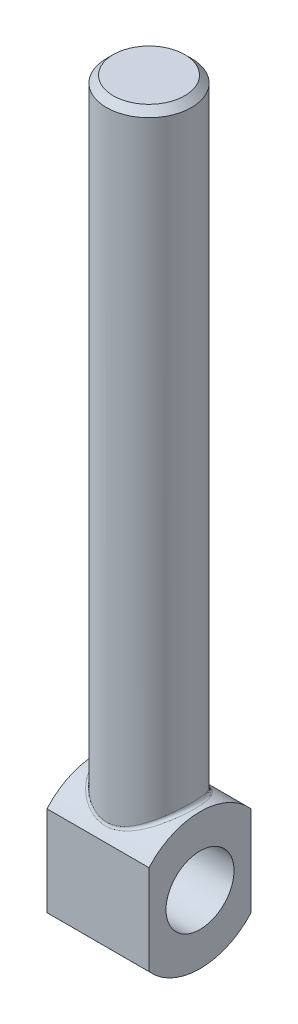
ISO-10303-21;
HEADER;
FILE_DESCRIPTION(('STEP AP214'),'2;1');
FILE_NAME('part.step','',(''),(''),'','','');
FILE_SCHEMA(('AUTOMOTIVE_DESIGN { 1 0 10303 214 1 1 1 1 }'));
ENDSEC;
DATA;
#1=APPLICATION_CONTEXT('core data for automotive mechanical design processes');
#2=APPLICATION_PROTOCOL_DEFINITION('international standard','automotive_design',2000,#1);
#3=PRODUCT_CONTEXT('',#1,'mechanical');
#4=PRODUCT('Part','Part','',(#3));
#5=PRODUCT_RELATED_PRODUCT_CATEGORY('part','',(#4));
#6=PRODUCT_DEFINITION_FORMATION('','',#4);
#7=PRODUCT_DEFINITION_CONTEXT('part definition',#1,'design');
#8=PRODUCT_DEFINITION('design','',#6,#7);
#9=PRODUCT_DEFINITION_SHAPE('','',#8);
#10=(LENGTH_UNIT() NAMED_UNIT(*) SI_UNIT(.MILLI.,.METRE.));
#11=(NAMED_UNIT(*) PLANE_ANGLE_UNIT() SI_UNIT($,.RADIAN.));
#12=(NAMED_UNIT(*) SI_UNIT($,.STERADIAN.) SOLID_ANGLE_UNIT());
#13=UNCERTAINTY_MEASURE_WITH_UNIT(LENGTH_MEASURE(1.E-05),#10,'distance_accuracy_value','');
#14=(GEOMETRIC_REPRESENTATION_CONTEXT(3) GLOBAL_UNCERTAINTY_ASSIGNED_CONTEXT((#13)) GLOBAL_UNIT_ASSIGNED_CONTEXT((#10,
#11,#12)) REPRESENTATION_CONTEXT('',''));
#15=CARTESIAN_POINT('',(0.,0.,0.));
#16=DIRECTION('',(0.,0.,1.));
#17=DIRECTION('',(1.,0.,0.));
#18=AXIS2_PLACEMENT_3D('',#15,#16,#17);
#19=CARTESIAN_POINT('',(3.,0.,0.));
#20=DIRECTION('',(-1.,0.,0.));
#21=DIRECTION('',(0.,0.,1.));
#22=AXIS2_PLACEMENT_3D('',#19,#20,#21);
#23=CYLINDRICAL_SURFACE('',#22,4.);
#24=CARTESIAN_POINT('',(3.,0.,0.));
#25=DIRECTION('',(1.,0.,0.));
#26=DIRECTION('',(0.,0.,-1.));
#27=AXIS2_PLACEMENT_3D('',#24,#25,#26);
#28=CIRCLE('',#27,4.);
#29=CARTESIAN_POINT('',(3.,2.64575131106459,-3.));
#30=VERTEX_POINT('',#29);
#31=CARTESIAN_POINT('',(3.,2.64575131106459,3.));
#32=VERTEX_POINT('',#31);
#33=EDGE_CURVE('E110',#30,#32,#28,.T.);
#34=ORIENTED_EDGE('',*,*,#33,.F.);
#35=DIRECTION('',(-1.,0.,0.));
#36=VECTOR('',#35,1.);
#37=CARTESIAN_POINT('',(3.,2.64575131106459,-3.));
#38=LINE('',#37,#36);
#39=CARTESIAN_POINT('',(-3.,2.64575131106459,-3.));
#40=VERTEX_POINT('',#39);
#41=EDGE_CURVE('E79',#30,#40,#38,.T.);
#42=ORIENTED_EDGE('',*,*,#41,.T.);
#43=CARTESIAN_POINT('',(-3.,0.,0.));
#44=DIRECTION('',(1.,0.,0.));
#45=DIRECTION('',(0.,0.,-1.));
#46=AXIS2_PLACEMENT_3D('',#43,#44,#45);
#47=CIRCLE('',#46,4.);
#48=CARTESIAN_POINT('',(-3.,2.64575131106459,3.));
#49=VERTEX_POINT('',#48);
#50=EDGE_CURVE('E102',#40,#49,#47,.T.);
#51=ORIENTED_EDGE('',*,*,#50,.T.);
#52=DIRECTION('',(-1.,0.,0.));
#53=VECTOR('',#52,1.);
#54=CARTESIAN_POINT('',(3.,2.64575131106459,3.));
#55=LINE('',#54,#53);
#56=EDGE_CURVE('E83',#32,#49,#55,.T.);
#57=ORIENTED_EDGE('',*,*,#56,.F.);
#58=EDGE_LOOP('',(#34,#42,#51,#57));
#59=FACE_BOUND('',#58,.T.);
#60=ADVANCED_FACE('F46',(#59),#23,.T.);
#61=CARTESIAN_POINT('',(-3.,-2.64575131106459,3.));
#62=VERTEX_POINT('',#61);
#63=CARTESIAN_POINT('',(-3.,-2.64575131106459,-3.));
#64=VERTEX_POINT('',#63);
#65=EDGE_CURVE('E100',#62,#64,#47,.T.);
#66=ORIENTED_EDGE('',*,*,#65,.T.);
#67=DIRECTION('',(-1.,0.,0.));
#68=VECTOR('',#67,1.);
#69=CARTESIAN_POINT('',(3.,-2.64575131106459,-3.));
#70=LINE('',#69,#68);
#71=CARTESIAN_POINT('',(3.,-2.64575131106459,-3.));
#72=VERTEX_POINT('',#71);
#73=EDGE_CURVE('E86',#72,#64,#70,.T.);
#74=ORIENTED_EDGE('',*,*,#73,.F.);
#75=CARTESIAN_POINT('',(3.,-2.64575131106459,3.));
#76=VERTEX_POINT('',#75);
#77=EDGE_CURVE('E108',#76,#72,#28,.T.);
#78=ORIENTED_EDGE('',*,*,#77,.F.);
#79=DIRECTION('',(-1.,0.,0.));
#80=VECTOR('',#79,1.);
#81=CARTESIAN_POINT('',(3.,-2.64575131106459,3.));
#82=LINE('',#81,#80);
#83=EDGE_CURVE('E105',#76,#62,#82,.T.);
#84=ORIENTED_EDGE('',*,*,#83,.T.);
#85=EDGE_LOOP('',(#66,#74,#78,#84));
#86=FACE_BOUND('',#85,.T.);
#87=ADVANCED_FACE('F104',(#86),#23,.T.);
#88=CARTESIAN_POINT('',(3.,0.,0.));
#89=DIRECTION('',(1.,0.,0.));
#90=DIRECTION('',(0.,0.,-1.));
#91=AXIS2_PLACEMENT_3D('',#88,#89,#90);
#92=PLANE('',#91);
#93=CARTESIAN_POINT('',(3.,0.,0.));
#94=DIRECTION('',(-1.,0.,0.));
#95=DIRECTION('',(0.,0.,1.));
#96=AXIS2_PLACEMENT_3D('',#93,#94,#95);
#97=CIRCLE('',#96,2.);
#98=CARTESIAN_POINT('',(3.,0.,2.));
#99=VERTEX_POINT('',#98);
#100=EDGE_CURVE('E49',#99,#99,#97,.T.);
#101=ORIENTED_EDGE('',*,*,#100,.T.);
#102=EDGE_LOOP('',(#101));
#103=FACE_BOUND('',#102,.T.);
#104=DIRECTION('',(0.,1.,0.));
#105=VECTOR('',#104,1.);
#106=CARTESIAN_POINT('',(3.,0.,-3.));
#107=LINE('',#106,#105);
#108=EDGE_CURVE('E90',#72,#30,#107,.T.);
#109=ORIENTED_EDGE('',*,*,#108,.T.);
#110=ORIENTED_EDGE('',*,*,#33,.T.);
#111=DIRECTION('',(0.,1.,0.));
#112=VECTOR('',#111,1.);
#113=CARTESIAN_POINT('',(3.,0.,3.));
#114=LINE('',#113,#112);
#115=EDGE_CURVE('E114',#76,#32,#114,.T.);
#116=ORIENTED_EDGE('',*,*,#115,.F.);
#117=ORIENTED_EDGE('',*,*,#77,.T.);
#118=EDGE_LOOP('',(#109,#110,#116,#117));
#119=FACE_BOUND('',#118,.T.);
#120=ADVANCED_FACE('F120',(#103,#119),#92,.T.);
#121=CARTESIAN_POINT('',(-3.,0.,0.));
#122=DIRECTION('',(1.,0.,0.));
#123=DIRECTION('',(0.,0.,-1.));
#124=AXIS2_PLACEMENT_3D('',#121,#122,#123);
#125=PLANE('',#124);
#126=CARTESIAN_POINT('',(-3.,0.,0.));
#127=DIRECTION('',(-1.,0.,0.));
#128=DIRECTION('',(0.,0.,1.));
#129=AXIS2_PLACEMENT_3D('',#126,#127,#128);
#130=CIRCLE('',#129,2.);
#131=CARTESIAN_POINT('',(-3.,0.,2.));
#132=VERTEX_POINT('',#131);
#133=EDGE_CURVE('E12',#132,#132,#130,.T.);
#134=ORIENTED_EDGE('',*,*,#133,.F.);
#135=EDGE_LOOP('',(#134));
#136=FACE_BOUND('',#135,.T.);
#137=ORIENTED_EDGE('',*,*,#50,.F.);
#138=DIRECTION('',(0.,1.,0.));
#139=VECTOR('',#138,1.);
#140=CARTESIAN_POINT('',(-3.,0.,-3.));
#141=LINE('',#140,#139);
#142=EDGE_CURVE('E89',#64,#40,#141,.T.);
#143=ORIENTED_EDGE('',*,*,#142,.F.);
#144=ORIENTED_EDGE('',*,*,#65,.F.);
#145=DIRECTION('',(0.,1.,0.));
#146=VECTOR('',#145,1.);
#147=CARTESIAN_POINT('',(-3.,0.,3.));
#148=LINE('',#147,#146);
#149=EDGE_CURVE('E62',#62,#49,#148,.T.);
#150=ORIENTED_EDGE('',*,*,#149,.T.);
#151=EDGE_LOOP('',(#137,#143,#144,#150));
#152=FACE_BOUND('',#151,.T.);
#153=ADVANCED_FACE('F99',(#136,#152),#125,.F.);
#154=CARTESIAN_POINT('',(3.,0.,3.));
#155=DIRECTION('',(0.,0.,1.));
#156=DIRECTION('',(1.,0.,0.));
#157=AXIS2_PLACEMENT_3D('',#154,#155,#156);
#158=PLANE('',#157);
#159=ORIENTED_EDGE('',*,*,#149,.F.);
#160=ORIENTED_EDGE('',*,*,#83,.F.);
#161=ORIENTED_EDGE('',*,*,#115,.T.);
#162=ORIENTED_EDGE('',*,*,#56,.T.);
#163=EDGE_LOOP('',(#159,#160,#161,#162));
#164=FACE_BOUND('',#163,.T.);
#165=ADVANCED_FACE('F133',(#164),#158,.T.);
#166=CARTESIAN_POINT('',(3.,0.,-3.));
#167=DIRECTION('',(0.,0.,1.));
#168=DIRECTION('',(1.,0.,0.));
#169=AXIS2_PLACEMENT_3D('',#166,#167,#168);
#170=PLANE('',#169);
#171=ORIENTED_EDGE('',*,*,#142,.T.);
#172=ORIENTED_EDGE('',*,*,#41,.F.);
#173=ORIENTED_EDGE('',*,*,#108,.F.);
#174=ORIENTED_EDGE('',*,*,#73,.T.);
#175=EDGE_LOOP('',(#171,#172,#173,#174));
#176=FACE_BOUND('',#175,.T.);
#177=ADVANCED_FACE('F88',(#176),#170,.F.);
#178=CARTESIAN_POINT('',(3.,0.,0.));
#179=DIRECTION('',(-1.,0.,0.));
#180=DIRECTION('',(0.,0.,1.));
#181=AXIS2_PLACEMENT_3D('',#178,#179,#180);
#182=CYLINDRICAL_SURFACE('',#181,2.);
#183=ORIENTED_EDGE('',*,*,#100,.F.);
#184=EDGE_LOOP('',(#183));
#185=FACE_BOUND('',#184,.T.);
#186=ORIENTED_EDGE('',*,*,#133,.T.);
#187=EDGE_LOOP('',(#186));
#188=FACE_BOUND('',#187,.T.);
#189=ADVANCED_FACE('F124',(#185,#188),#182,.F.);
#190=CLOSED_SHELL('',(#60,#87,#120,#153,#165,#177,#189));
#191=MANIFOLD_SOLID_BREP('B2',#190);
#192=CARTESIAN_POINT('',(3.,0.,0.));
#193=DIRECTION('',(-1.,0.,0.));
#194=DIRECTION('',(0.,0.,1.));
#195=AXIS2_PLACEMENT_3D('',#192,#193,#194);
#196=CYLINDRICAL_SURFACE('',#195,4.);
#197=CARTESIAN_POINT('',(0.00954822163204484,3.21715811532178,-2.49998176622624));
#198=CARTESIAN_POINT('',(0.00984711982917236,3.12390662318316,-2.49998062463942));
#199=CARTESIAN_POINT('',(0.0103120793626084,3.06396010983027,-2.57140981668985));
#200=CARTESIAN_POINT('',(-0.102346887351053,3.21677036700459,-2.50040969262202));
#201=CARTESIAN_POINT('',(-0.105537420109464,3.12354283273414,-2.50043539427607));
#202=CARTESIAN_POINT('',(-0.110534638340057,3.0635908257028,-2.57184996954455));
#203=CARTESIAN_POINT('',(-0.21429020075692,3.22328653193699,-2.49327885304179));
#204=CARTESIAN_POINT('',(-0.221259244170947,3.12969276039507,-2.49281907066194));
#205=CARTESIAN_POINT('',(-0.231433416820897,3.06979669702363,-2.56451539166456));
#206=CARTESIAN_POINT('',(-0.435009736366286,3.24909656567273,-2.46438285730942));
#207=CARTESIAN_POINT('',(-0.44866986006418,3.15389345693847,-2.46213883644658));
#208=CARTESIAN_POINT('',(-0.469810515272162,3.09437768165235,-2.53479379612528));
#209=CARTESIAN_POINT('',(-0.543782843969047,3.26840258567563,-2.44260378407605));
#210=CARTESIAN_POINT('',(-0.560854563338687,3.17206483290037,-2.43892004452898));
#211=CARTESIAN_POINT('',(-0.587285471473778,3.11276436753144,-2.51239246375399));
#212=CARTESIAN_POINT('',(-0.755450166276625,3.31710352845769,-2.3856457498194));
#213=CARTESIAN_POINT('',(-0.778294499469588,3.21757806013281,-2.37858039630654));
#214=CARTESIAN_POINT('',(-0.815886179591528,3.15914621735777,-2.45380705682438));
#215=CARTESIAN_POINT('',(-0.858352972196771,3.34648324225128,-2.35048698035186));
#216=CARTESIAN_POINT('',(-0.883937662251834,3.2450797037186,-2.34123478674779));
#217=CARTESIAN_POINT('',(-0.927021210020152,3.18712689655799,-2.41764375072408));
#218=CARTESIAN_POINT('',(-1.05711271269485,3.41218022549462,-2.26806162497307));
#219=CARTESIAN_POINT('',(-1.08709172676679,3.30613063601418,-2.25425246119234));
#220=CARTESIAN_POINT('',(-1.14168172975108,3.24969545211758,-2.33286338523401));
#221=CARTESIAN_POINT('',(-1.15296717389699,3.44849991435416,-2.22079081460447));
#222=CARTESIAN_POINT('',(-1.18483265152331,3.33986091893003,-2.20430946221334));
#223=CARTESIAN_POINT('',(-1.24520454780751,3.28428563267719,-2.28424198068837));
#224=CARTESIAN_POINT('',(-1.35634125071307,3.53319084142273,-2.10400680971304));
#225=CARTESIAN_POINT('',(-1.39150277184332,3.41803158747329,-2.08157570753947));
#226=CARTESIAN_POINT('',(-1.46484855077161,3.36494365854757,-2.16412129004828));
#227=CARTESIAN_POINT('',(-1.4620453639553,3.58248690528422,-2.03190427936437));
#228=CARTESIAN_POINT('',(-1.49817235349947,3.46330272805284,-2.00591125316473));
#229=CARTESIAN_POINT('',(-1.57900899313801,3.41189228988917,-2.08995868693743));
#230=CARTESIAN_POINT('',(-1.66107729043178,3.68228723429981,-1.87272181346715));
#231=CARTESIAN_POINT('',(-1.69760563692384,3.55399909628589,-1.84053405133779));
#232=CARTESIAN_POINT('',(-1.79396347373621,3.50694022215852,-1.92622815049652));
#233=CARTESIAN_POINT('',(-1.75439106081195,3.73279279504906,-1.78562513634711));
#234=CARTESIAN_POINT('',(-1.79025677682375,3.59953311074717,-1.75028295469806));
#235=CARTESIAN_POINT('',(-1.89474234568546,3.55504075698829,-1.8366429972653));
#236=CARTESIAN_POINT('',(-1.94141375009508,3.838974333098,-1.58208271832439));
#237=CARTESIAN_POINT('',(-1.97484829448343,3.69438989345253,-1.54128586467245));
#238=CARTESIAN_POINT('',(-2.09672685009275,3.65616603175598,-1.62728508184499));
#239=CARTESIAN_POINT('',(-2.03271099413715,3.8941523981321,-1.4631672535127));
#240=CARTESIAN_POINT('',(-2.06327158652079,3.74279564380438,-1.42024220943881));
#241=CARTESIAN_POINT('',(-2.19532787371962,3.70871656933128,-1.50497203211585));
#242=CARTESIAN_POINT('',(-2.19375576520822,3.99479100437253,-1.20834520046678));
#243=CARTESIAN_POINT('',(-2.21791194346011,3.8300258686162,-1.16454212470812));
#244=CARTESIAN_POINT('',(-2.36925622641418,3.80456286094451,-1.2428693488957));
#245=CARTESIAN_POINT('',(-2.26351666710338,4.04025757135056,-1.07244923172584));
#246=CARTESIAN_POINT('',(-2.28321987609047,3.86842525180819,-1.02988947228783));
#247=CARTESIAN_POINT('',(-2.44459800033743,3.84786435381197,-1.10309063831186));
#248=CARTESIAN_POINT('',(-2.37375498919275,4.11342803459662,-0.797266295997932));
#249=CARTESIAN_POINT('',(-2.38588988233057,3.92975382798085,-0.760680630325499));
#250=CARTESIAN_POINT('',(-2.56365538845275,3.91755050900527,-0.820045333058661));
#251=CARTESIAN_POINT('',(-2.41597717440544,4.14217397544154,-0.658925574865658));
#252=CARTESIAN_POINT('',(-2.42412270615203,3.95314455369271,-0.627347863181621));
#253=CARTESIAN_POINT('',(-2.60925534882904,3.94492759482809,-0.677752019851812));
#254=CARTESIAN_POINT('',(-2.47593752149281,4.18326412026029,-0.375081589801691));
#255=CARTESIAN_POINT('',(-2.4786636512368,3.98669817029616,-0.355120944382691));
#256=CARTESIAN_POINT('',(-2.67401252367401,3.98406106605013,-0.385798206623646));
#257=CARTESIAN_POINT('',(-2.49371061477181,4.19563172368043,-0.229588852933674));
#258=CARTESIAN_POINT('',(-2.49437098908094,3.99649494144323,-0.217686697874435));
#259=CARTESIAN_POINT('',(-2.69320746406037,3.99583973663436,-0.23614853443916));
#260=CARTESIAN_POINT('',(-2.50274557788523,4.2019079022033,0.0400799682553251));
#261=CARTESIAN_POINT('',(-2.50245998592779,4.00153266855657,0.0381967083341126));
#262=CARTESIAN_POINT('',(-2.70296522402564,4.00181704989023,0.0412251101996328));
#263=CARTESIAN_POINT('',(-2.49765843638656,4.19835873149385,0.164099700936877));
#264=CARTESIAN_POINT('',(-2.49796952981467,3.99872566656385,0.15514436182214));
#265=CARTESIAN_POINT('',(-2.69747111129446,3.99843688715574,0.168788263820359));
#266=CARTESIAN_POINT('',(-2.46936786585877,4.17879251317735,0.40918008518493));
#267=CARTESIAN_POINT('',(-2.47247806218026,3.98291321537001,0.388448025828614));
#268=CARTESIAN_POINT('',(-2.66691729516989,3.9798023934274,0.420870944762257));
#269=CARTESIAN_POINT('',(-2.44616477289519,4.16277569685523,0.530240791600795));
#270=CARTESIAN_POINT('',(-2.45170879962532,3.97005121410041,0.50376260888169));
#271=CARTESIAN_POINT('',(-2.64185795472728,3.96454828270488,0.545390528499919));
#272=CARTESIAN_POINT('',(-2.38385449543303,4.12040273653024,0.76240245591021));
#273=CARTESIAN_POINT('',(-2.39465232492338,3.9351982628355,0.727739115078123));
#274=CARTESIAN_POINT('',(-2.57456285506721,3.92419308242369,0.784185383225571));
#275=CARTESIAN_POINT('',(-2.34525727565115,4.09437900130782,0.873695056300592));
#276=CARTESIAN_POINT('',(-2.3592858925295,3.91375440450672,0.835751467780918));
#277=CARTESIAN_POINT('',(-2.53287785774129,3.8994085726587,0.898657772209811));
#278=CARTESIAN_POINT('',(-2.25379176859153,4.03401693294661,1.0881275381792));
#279=CARTESIAN_POINT('',(-2.27373860025791,3.86293261660582,1.04632468853517));
#280=CARTESIAN_POINT('',(-2.43409511010197,3.84192088849902,1.11921689641318));
#281=CARTESIAN_POINT('',(-2.20092116468144,3.99967725018662,1.19126609271405));
#282=CARTESIAN_POINT('',(-2.22402460242239,3.83381545863923,1.14853815767518));
#283=CARTESIAN_POINT('',(-2.37699485782563,3.80921642875081,1.22530226676597));
#284=CARTESIAN_POINT('',(-2.07593399029326,3.92087568244877,1.39884463824707));
#285=CARTESIAN_POINT('',(-2.10457691437104,3.76586030924228,1.35600554563722));
#286=CARTESIAN_POINT('',(-2.24200870955041,3.73416731661604,1.43881162793973));
#287=CARTESIAN_POINT('',(-2.00233286973393,3.87571344327239,1.50215927721096));
#288=CARTESIAN_POINT('',(-2.03361919350488,3.72647401971043,1.46056969839389));
#289=CARTESIAN_POINT('',(-2.16251949948341,3.69115566022506,1.54507811382321));
#290=CARTESIAN_POINT('',(-1.84132922570655,3.78144584448515,1.6956933968843));
#291=CARTESIAN_POINT('',(-1.87605143684688,3.64302897635808,1.65784457982731));
#292=CARTESIAN_POINT('',(-1.98863556394272,3.60137699470873,1.74414177977646));
#293=CARTESIAN_POINT('',(-1.7539160935783,3.7323374683119,1.78590270864718));
#294=CARTESIAN_POINT('',(-1.78982393269357,3.59908655846668,1.75082635274102));
#295=CARTESIAN_POINT('',(-1.8942293811158,3.55460711266686,1.83692850035819));
#296=CARTESIAN_POINT('',(-1.55245774368914,3.62640015650592,1.96486482680486));
#297=CARTESIAN_POINT('',(-1.589365763107,3.50353827748288,1.93565008015919));
#298=CARTESIAN_POINT('',(-1.67665436312527,3.45371443478036,2.02100382181569));
#299=CARTESIAN_POINT('',(-1.4363840841985,3.5695291536427,2.05132465758035));
#300=CARTESIAN_POINT('',(-1.47270306323978,3.45151465206491,2.02621780635995));
#301=CARTESIAN_POINT('',(-1.55129481091872,3.39955157490121,2.1099339335004));
#302=CARTESIAN_POINT('',(-1.18925238761436,3.46190902682007,2.20379381114977));
#303=CARTESIAN_POINT('',(-1.22251006047174,3.35258753079578,2.18590772387726));
#304=CARTESIAN_POINT('',(-1.28439257863916,3.29705621601571,2.266759348622));
#305=CARTESIAN_POINT('',(-1.05820546892183,3.41115541719861,2.26981817491904));
#306=CARTESIAN_POINT('',(-1.08882637970896,3.3053523434133,2.25586835990305));
#307=CARTESIAN_POINT('',(-1.14286190643923,3.24871944495027,2.33467012277639));
#308=CARTESIAN_POINT('',(-0.816044933351373,3.33393079051521,2.36574363566808));
#309=CARTESIAN_POINT('',(-0.840653529754404,3.23339337160701,2.35736070674726));
#310=CARTESIAN_POINT('',(-0.881328528016704,3.17517218144366,2.43333631097097));
#311=CARTESIAN_POINT('',(-0.707654515306206,3.30455532994537,2.40050700013342));
#312=CARTESIAN_POINT('',(-0.729261152660879,3.20585469128816,2.39432583523667));
#313=CARTESIAN_POINT('',(-0.764266876529977,3.14719555232907,2.46909291442244));
#314=CARTESIAN_POINT('',(-0.485238657916296,3.25743976185752,2.45510895826413));
#315=CARTESIAN_POINT('',(-0.500621840187745,3.16179175792709,2.45219553125472));
#316=CARTESIAN_POINT('',(-0.524057750550322,3.1023235827213,2.52525492850076));
#317=CARTESIAN_POINT('',(-0.371231044594212,3.23966511213803,2.47499188561794));
#318=CARTESIAN_POINT('',(-0.382946458986062,3.14504692578714,2.47340792109486));
#319=CARTESIAN_POINT('',(-0.400929528161873,3.08539534489338,2.54570593949284));
#320=CARTESIAN_POINT('',(-0.204348558571414,3.22421949415986,2.49217726688393));
#321=CARTESIAN_POINT('',(-0.210772124811284,3.13053789426956,2.49168497512334));
#322=CARTESIAN_POINT('',(-0.220696443257071,3.07068523253319,2.56338233165199));
#323=CARTESIAN_POINT('',(-0.152495514902251,3.22086709248009,2.49588600807579));
#324=CARTESIAN_POINT('',(-0.157279988011177,3.12738923303885,2.49562768554508));
#325=CARTESIAN_POINT('',(-0.164695156094415,3.06749246902861,2.56719703687792));
#326=CARTESIAN_POINT('',(-0.0485585733601719,3.21707893777755,2.50007008209406));
#327=CARTESIAN_POINT('',(-0.0500968615874331,3.12383268850076,2.50007391199616));
#328=CARTESIAN_POINT('',(-0.0524432592290021,3.06388470264534,2.57150065586822));
#329=CARTESIAN_POINT('',(0.00352537328929792,3.21664383357373,2.50054469563757));
#330=CARTESIAN_POINT('',(0.0036482296928791,3.12342182211032,2.50058116287201));
#331=CARTESIAN_POINT('',(0.00380740315243156,3.06347031768947,2.57198882979875));
#332=CARTESIAN_POINT('',(0.180532612992821,3.22024045745077,2.4965913766891));
#333=CARTESIAN_POINT('',(0.186232158189478,3.1268065795393,2.49637047224875));
#334=CARTESIAN_POINT('',(0.194975222032271,3.06689567376216,2.56792255887996));
#335=CARTESIAN_POINT('',(0.305301618741633,3.23138204563185,2.48436581108853));
#336=CARTESIAN_POINT('',(0.315244416122179,3.13732784501259,2.48330423173868));
#337=CARTESIAN_POINT('',(0.329725748241035,3.07750671012264,2.55534769140385));
#338=CARTESIAN_POINT('',(0.549845845397139,3.26884569935756,2.44196379111183));
#339=CARTESIAN_POINT('',(0.567023357904146,3.17242199265639,2.43831339801565));
#340=CARTESIAN_POINT('',(0.593833513028838,3.11318638034347,2.5117341851451));
#341=CARTESIAN_POINT('',(0.669606177482777,3.29520999170842,2.41173739623305));
#342=CARTESIAN_POINT('',(0.690426411155642,3.19722533205408,2.40608533874403));
#343=CARTESIAN_POINT('',(0.723174671681138,3.13829523020979,2.48064417898833));
#344=CARTESIAN_POINT('',(0.899962323005202,3.35862187692461,2.33552032646157));
#345=CARTESIAN_POINT('',(0.926602176681831,3.25635507177462,2.32546588926626));
#346=CARTESIAN_POINT('',(0.971959308845878,3.19868750182175,2.40224947864046));
#347=CARTESIAN_POINT('',(1.01063421340312,3.39556588723344,2.28968171917118));
#348=CARTESIAN_POINT('',(1.03991082003281,3.29084329455372,2.27684665161289));
#349=CARTESIAN_POINT('',(1.09148495047634,3.23387227351396,2.35510119684051));
#350=CARTESIAN_POINT('',(1.22266876237302,3.47593946758788,2.18383566850962));
#351=CARTESIAN_POINT('',(1.25583109679632,3.36522023259862,2.16547069823017));
#352=CARTESIAN_POINT('',(1.3204822633619,3.31041854060159,2.24623097334546));
#353=CARTESIAN_POINT('',(1.32403156197289,3.51936893935593,2.12382843983492));
#354=CARTESIAN_POINT('',(1.35865947666875,3.4053320595934,2.10228101982547));
#355=CARTESIAN_POINT('',(1.42995408692714,3.35177994239932,2.18450925248103));
#356=CARTESIAN_POINT('',(1.53122568293377,3.6156759685942,1.98078076494807));
#357=CARTESIAN_POINT('',(1.56786261366816,3.49358663345472,1.95271345832086));
#358=CARTESIAN_POINT('',(1.6537237375726,3.44350092229165,2.03737450099809));
#359=CARTESIAN_POINT('',(1.63543016252322,3.66899129231365,1.89563233886144));
#360=CARTESIAN_POINT('',(1.67211445686651,3.54208006182435,1.86391465635286));
#361=CARTESIAN_POINT('',(1.76626457554155,3.49427742053628,1.94979326246415));
#362=CARTESIAN_POINT('',(1.8292764138933,3.77423980699449,1.70933761313926));
#363=CARTESIAN_POINT('',(1.86450821158952,3.63671459517285,1.67184463869918));
#364=CARTESIAN_POINT('',(1.97561852698875,3.5945141011825,1.75817583027378));
#365=CARTESIAN_POINT('',(1.91890517699541,3.82617172909882,1.60817718009678));
#366=CARTESIAN_POINT('',(1.95234645097243,3.68285967696277,1.56803564708243));
#367=CARTESIAN_POINT('',(2.07241759109415,3.64397307514972,1.65412509939926));
#368=CARTESIAN_POINT('',(2.09032416257436,3.9293785418648,1.37951147724162));
#369=CARTESIAN_POINT('',(2.11915619197639,3.77362672215531,1.33597009531128));
#370=CARTESIAN_POINT('',(2.25755009564767,3.74226527816834,1.41892609101962));
#371=CARTESIAN_POINT('',(2.17027297532218,3.97999877782238,1.25034966457757));
#372=CARTESIAN_POINT('',(2.19519058850869,3.81713863721484,1.20636133379561));
#373=CARTESIAN_POINT('',(2.34389481361212,3.79047502647051,1.28607394083922));
#374=CARTESIAN_POINT('',(2.30640525507358,4.06831855017555,0.976610645047704));
#375=CARTESIAN_POINT('',(2.32378040952862,3.89231708387356,0.93540804007776));
#376=CARTESIAN_POINT('',(2.49091767572175,3.87458909529686,1.0045138064034));
#377=CARTESIAN_POINT('',(2.36261898494131,4.10603452812883,0.83205336426927));
#378=CARTESIAN_POINT('',(2.37531040272873,3.92343526837049,0.794559754186552));
#379=CARTESIAN_POINT('',(2.55162850376076,3.91050907444693,0.855826317552216));
#380=CARTESIAN_POINT('',(2.44251762548342,4.16024529406297,0.550341868757266));
#381=CARTESIAN_POINT('',(2.44852046284723,3.9680679037097,0.522677253030804));
#382=CARTESIAN_POINT('',(2.63791903550087,3.96213837526421,0.566065922134414));
#383=CARTESIAN_POINT('',(2.46931638886961,4.17875621565689,0.414409644869066));
#384=CARTESIAN_POINT('',(2.47243461760453,3.98288572761527,0.393315972603401));
#385=CARTESIAN_POINT('',(2.66686170008662,3.97976782422415,0.426249920429951));
#386=CARTESIAN_POINT('',(2.49996518684713,4.19995496049807,0.138980557428749));
#387=CARTESIAN_POINT('',(2.50006031504386,4.00002311379512,0.131164463961864));
#388=CARTESIAN_POINT('',(2.69996240192562,3.9999571050188,0.142951430499641));
#389=CARTESIAN_POINT('',(2.50383718585216,4.20265792813005,-0.00051276575552528));
#390=CARTESIAN_POINT('',(2.50347438814422,4.00215837736447,-0.000136664345919171));
#391=CARTESIAN_POINT('',(2.7041441607459,4.00253136007674,-0.000527416204987891));
#392=CARTESIAN_POINT('',(2.48944677495272,4.19268068180773,-0.259182319746946));
#393=CARTESIAN_POINT('',(2.49052354454473,3.9941071193982,-0.245803898580278));
#394=CARTESIAN_POINT('',(2.68860251692676,3.99302922081014,-0.266587528883177));
#395=CARTESIAN_POINT('',(2.47405107508596,4.18199259079061,-0.378600102782188));
#396=CARTESIAN_POINT('',(2.47683308000064,3.98558648149042,-0.358954494186143));
#397=CARTESIAN_POINT('',(2.67197516110836,3.98285008645628,-0.389417248577089));
#398=CARTESIAN_POINT('',(2.42668867668845,4.1494971039864,-0.612737319598301));
#399=CARTESIAN_POINT('',(2.433820449596,3.95909851400715,-0.58330534327402));
#400=CARTESIAN_POINT('',(2.62082377085168,3.95190200376875,-0.630244100160557));
#401=CARTESIAN_POINT('',(2.39472017200016,4.12768849625389,-0.727456239811328));
#402=CARTESIAN_POINT('',(2.40483844142197,3.94133861605859,-0.693681365471061));
#403=CARTESIAN_POINT('',(2.58629778576325,3.93113190120137,-0.748240703808901));
#404=CARTESIAN_POINT('',(2.31503081392148,4.07431114189134,-0.951308089444161));
#405=CARTESIAN_POINT('',(2.33103655178172,3.89688145014388,-0.911693384343932));
#406=CARTESIAN_POINT('',(2.50023327903208,3.8802963256035,-0.978488320568126));
#407=CARTESIAN_POINT('',(2.26706608813816,4.04259180450601,-1.06032226318306));
#408=CARTESIAN_POINT('',(2.28644267333808,3.87031904598625,-1.01876662920885));
#409=CARTESIAN_POINT('',(2.44843137520569,3.85008743280471,-1.09061718497853));
#410=CARTESIAN_POINT('',(2.15727533265907,3.97189777582152,-1.26888425386343));
#411=CARTESIAN_POINT('',(2.18237190611263,3.80991330159106,-1.22585971353082));
#412=CARTESIAN_POINT('',(2.32985735929282,3.78275978643317,-1.30513808967848));
#413=CARTESIAN_POINT('',(2.095446024527,3.9329213688772,-1.36842982390531));
#414=CARTESIAN_POINT('',(2.12337135885792,3.77631765013154,-1.32570940584408));
#415=CARTESIAN_POINT('',(2.26308170649512,3.74563939891266,-1.40752781887131));
#416=CARTESIAN_POINT('',(1.95030487152963,3.84471843273871,-1.5696218777935));
#417=CARTESIAN_POINT('',(1.98291976294462,3.69919372725745,-1.52885486891008));
#418=CARTESIAN_POINT('',(2.10632926124523,3.66163660262875,-1.61446821716213));
#419=CARTESIAN_POINT('',(1.86521898908537,3.79481852499889,-1.66973395801556));
#420=CARTESIAN_POINT('',(1.89978228635726,3.6550103319026,-1.63130687774758));
#421=CARTESIAN_POINT('',(2.01443650821038,3.6141128809568,-1.71744064253111));
#422=CARTESIAN_POINT('',(1.68089243946937,3.69299628689056,-1.85519069642677));
#423=CARTESIAN_POINT('',(1.71734532014243,3.56374213891941,-1.82208248377013));
#424=CARTESIAN_POINT('',(1.81536383462875,3.51713932084266,-1.90819614489528));
#425=CARTESIAN_POINT('',(1.58162853074913,3.64107073960635,-1.94051058760967));
#426=CARTESIAN_POINT('',(1.61831703529607,3.51667236276615,-1.9108446656871));
#427=CARTESIAN_POINT('',(1.70815881320958,3.46768641867127,-1.99595374725549));
#428=CARTESIAN_POINT('',(1.35623038823693,3.53298102231054,-2.10538748431311));
#429=CARTESIAN_POINT('',(1.39190446521209,3.41814920259598,-2.08242261670349));
#430=CARTESIAN_POINT('',(1.4647288192953,3.36474383077359,-2.16554141243653));
#431=CARTESIAN_POINT('',(1.22827849610822,3.47716757430175,-2.18268086024095));
#432=CARTESIAN_POINT('',(1.26214660128126,3.36654839721313,-2.16398362401794));
#433=CARTESIAN_POINT('',(1.32654077579669,3.31158816600163,-2.24504317053332));
#434=CARTESIAN_POINT('',(0.957682873288755,3.37655816915883,-2.3141595203485));
#435=CARTESIAN_POINT('',(0.986398057598796,3.27339107419613,-2.30239075277588));
#436=CARTESIAN_POINT('',(1.03429750315204,3.21576968491321,-2.38027836378726));
#437=CARTESIAN_POINT('',(0.815074363355199,3.33173663736355,-2.36839866432327));
#438=CARTESIAN_POINT('',(0.839985772821562,3.23135207032308,-2.36016814995811));
#439=CARTESIAN_POINT('',(0.880280312423758,3.17308251177658,-2.43606719759076));
#440=CARTESIAN_POINT('',(0.561314292077818,3.2718718737899,-2.43862943301191));
#441=CARTESIAN_POINT('',(0.578907191545676,3.17531830335934,-2.43470109080557));
#442=CARTESIAN_POINT('',(0.606219435443942,3.11606845122722,-2.50830455966861));
#443=CARTESIAN_POINT('',(0.452953446804301,3.25196847561906,-2.46114053086194));
#444=CARTESIAN_POINT('',(0.467160629601213,3.15658834145841,-2.45869436113383));
#445=CARTESIAN_POINT('',(0.48918972254839,3.09711283391864,-2.53145883174113));
#446=CARTESIAN_POINT('',(0.232924050148978,3.22481367092826,-2.49159327550055));
#447=CARTESIAN_POINT('',(0.240479112942294,3.13112895780947,-2.49102348381609));
#448=CARTESIAN_POINT('',(0.251557974161151,3.07125111517405,-2.56278165480314));
#449=CARTESIAN_POINT('',(0.121260159256246,3.21754522889821,-2.49955454034239));
#450=CARTESIAN_POINT('',(0.125058204143327,3.12426986675218,-2.49952653865026));
#451=CARTESIAN_POINT('',(0.130960971997663,3.0643287894427,-2.57097038436169));
#452=CARTESIAN_POINT('',(0.00954822163204484,3.21715811532178,-2.49998176622624));
#453=CARTESIAN_POINT('',(0.00984711982917236,3.12390662318316,-2.49998062463942));
#454=CARTESIAN_POINT('',(0.0103120793626084,3.06396010983027,-2.57140981668985));
#455=(BOUNDED_SURFACE() B_SPLINE_SURFACE(3,2,((#197,#198,#199),(#200,#201,#202),(#203,#204,
#205),(#206,#207,#208),(#209,#210,#211),(#212,#213,#214),(#215,#216,#217),(#218,#219,#220),
(#221,#222,#223),(#224,#225,#226),(#227,#228,#229),(#230,#231,#232),(#233,#234,#235),(#236,#237,
#238),(#239,#240,#241),(#242,#243,#244),(#245,#246,#247),(#248,#249,#250),(#251,#252,#253),
(#254,#255,#256),(#257,#258,#259),(#260,#261,#262),(#263,#264,#265),(#266,#267,#268),(#269,#270,
#271),(#272,#273,#274),(#275,#276,#277),(#278,#279,#280),(#281,#282,#283),(#284,#285,#286),
(#287,#288,#289),(#290,#291,#292),(#293,#294,#295),(#296,#297,#298),(#299,#300,#301),(#302,#303,
#304),(#305,#306,#307),(#308,#309,#310),(#311,#312,#313),(#314,#315,#316),(#317,#318,#319),
(#320,#321,#322),(#323,#324,#325),(#326,#327,#328),(#329,#330,#331),(#332,#333,#334),(#335,#336,
#337),(#338,#339,#340),(#341,#342,#343),(#344,#345,#346),(#347,#348,#349),(#350,#351,#352),
(#353,#354,#355),(#356,#357,#358),(#359,#360,#361),(#362,#363,#364),(#365,#366,#367),(#368,#369,
#370),(#371,#372,#373),(#374,#375,#376),(#377,#378,#379),(#380,#381,#382),(#383,#384,#385),
(#386,#387,#388),(#389,#390,#391),(#392,#393,#394),(#395,#396,#397),(#398,#399,#400),(#401,#402,
#403),(#404,#405,#406),(#407,#408,#409),(#410,#411,#412),(#413,#414,#415),(#416,#417,#418),
(#419,#420,#421),(#422,#423,#424),(#425,#426,#427),(#428,#429,#430),(#431,#432,#433),(#434,#435,
#436),(#437,#438,#439),(#440,#441,#442),(#443,#444,#445),(#446,#447,#448),(#449,#450,#451),
(#452,#453,#454)),.UNSPECIFIED.,.T.,.F.,.F.) B_SPLINE_SURFACE_WITH_KNOTS((4,2,2,2,2,2,2,2,2,2,2,
2,2,2,2,2,2,2,2,2,2,2,2,2,2,2,2,2,2,2,2,2,2,2,2,2,2,2,2,2,2,2,4),(3,3),(0.,0.36209940495535,
0.724543322355056,1.0864424239581,1.44846792154708,1.88699780604689,2.32602054073295,
2.8365576221154,3.34677700025479,3.8203137427461,4.29317321902411,4.69344225412874,
5.09370386409574,5.48168112859734,5.86972140139398,6.30081691512876,6.73224516664181,
7.22906189220719,7.72551207482999,8.10329059162156,8.47993905235368,8.64851170939174,
8.81712185643816,9.22188973099693,9.62778583703679,10.0298363891367,10.4318808493738,
10.8944864143135,11.3575026106399,11.8696581116987,12.3811586143354,12.830743476346,
13.2798975550367,13.6694987429686,14.0591423998194,14.4550208512087,14.8509930114036,
15.3004822500595,15.7507169626372,16.2606418828377,16.7693688688522,17.1313639719966,
17.4928706232502),(0.,1.),
.UNSPECIFIED.) GEOMETRIC_REPRESENTATION_ITEM() RATIONAL_B_SPLINE_SURFACE(((1.,0.906324380539875,
1.),(1.,0.906385117218736,1.),(1.,0.905370579191224,1.),(1.,0.901292780635838,1.),(1.,
0.898227571809121,1.),(1.,0.890320030501218,1.),(1.,0.885480376269695,1.),(1.,0.874355526718361,
1.),(1.,0.868069827122787,1.),(1.,0.852949904950243,1.),(1.,0.843857823939024,1.),(1.,
0.824700055089395,1.),(1.,0.814633284528398,1.),(1.,0.792620608119081,1.),(1.,0.780635719245852,
1.),(1.,0.757884550109469,1.),(1.,0.747117516156803,1.),(1.,0.729290403582043,1.),(1.,
0.722019465282272,1.),(1.,0.711502736775252,1.),(1.,0.708251204555617,1.),(1.,0.706606633309734,
1.),(1.,0.707544375835639,1.),(1.,0.712632368533337,1.),(1.,0.71678255911161,1.),(1.,
0.727493351078227,1.),(1.,0.733976065885035,1.),(1.,0.748567560966022,1.),(1.,0.756676605145556,
1.),(1.,0.774666605238937,1.),(1.,0.784644333062344,1.),(1.,0.804670623541557,1.),(1.,
0.814719234926551,1.),(1.,0.835585048387264,1.),(1.,0.846287910729496,1.),(1.,0.865777339119101,
1.),(1.,0.874565313151513,1.),(1.,0.887567831543224,1.),(1.,0.892373462787271,1.),(1.,
0.89998022935373,1.),(1.,0.902787317762163,1.),(1.,0.90521797813533,1.),(1.,0.905743556770984,
1.),(1.,0.906336850301069,1.),(1.,0.906404463342105,1.),(1.,0.905842900874474,1.),(1.,
0.904105155767984,1.),(1.,0.89814504202878,1.),(1.,0.893915761371101,1.),(1.,0.883446814803562,
1.),(1.,0.877226575375082,1.),(1.,0.86323513735804,1.),(1.,0.855463962271011,1.),(1.,
0.837596952633919,1.),(1.,0.827327277951987,1.),(1.,0.806183009074338,1.),(1.,0.795307886014084,
1.),(1.,0.772831241774174,1.),(1.,0.761275118682737,1.),(1.,0.740408064135659,1.),(1.,
0.731094280193555,1.),(1.,0.717444319912293,1.),(1.,0.712642087962757,1.),(1.,0.707128848736426,
1.),(1.,0.706413925738067,1.),(1.,0.709019771780881,1.),(1.,0.711818020678934,1.),(1.,
0.720153146110504,1.),(1.,0.72569032113798,1.),(1.,0.738870477886505,1.),(1.,0.746545737453029,
1.),(1.,0.763093437805496,1.),(1.,0.771966161547409,1.),(1.,0.791341854516671,1.),(1.,
0.801903083691045,1.),(1.,0.822598324467617,1.),(1.,0.832731598483615,1.),(1.,0.853045795823563,
1.),(1.,0.863054930510197,1.),(1.,0.880495077487701,1.),(1.,0.887932091158028,1.),(1.,
0.897671849737992,1.),(1.,0.90083677234868,1.),(1.,0.905131348876622,1.),(1.,0.90626374328645,
1.),(1.,0.906324380539875,1.))) REPRESENTATION_ITEM('') SURFACE());
#456=CARTESIAN_POINT('',(0.0103120793626084,3.06396010983027,-2.57140981668985));
#457=CARTESIAN_POINT('',(0.130960971997664,3.0643287894427,-2.57097038436169));
#458=CARTESIAN_POINT('',(0.251557974161151,3.07125111517405,-2.56278165480314));
#459=CARTESIAN_POINT('',(0.489189722548389,3.09711283391864,-2.53145883174113));
#460=CARTESIAN_POINT('',(0.606219435443941,3.11606845122722,-2.50830455966861));
#461=CARTESIAN_POINT('',(0.880280312423758,3.17308251177658,-2.43606719759076));
#462=CARTESIAN_POINT('',(1.03429750315204,3.21576968491321,-2.38027836378726));
#463=CARTESIAN_POINT('',(1.32654077579669,3.31158816600163,-2.24504317053332));
#464=CARTESIAN_POINT('',(1.4647288192953,3.36474383077359,-2.16554141243653));
#465=CARTESIAN_POINT('',(1.70815881320958,3.46768641867127,-1.99595374725549));
#466=CARTESIAN_POINT('',(1.81536383462874,3.51713932084266,-1.90819614489529));
#467=CARTESIAN_POINT('',(2.01443650821038,3.6141128809568,-1.71744064253111));
#468=CARTESIAN_POINT('',(2.10632926124523,3.66163660262875,-1.61446821716213));
#469=CARTESIAN_POINT('',(2.26308170649512,3.74563939891266,-1.40752781887131));
#470=CARTESIAN_POINT('',(2.32985735929282,3.78275978643317,-1.30513808967848));
#471=CARTESIAN_POINT('',(2.44843137520569,3.85008743280471,-1.09061718497853));
#472=CARTESIAN_POINT('',(2.50023327903208,3.8802963256035,-0.978488320568125));
#473=CARTESIAN_POINT('',(2.58629778576325,3.93113190120137,-0.748240703808901));
#474=CARTESIAN_POINT('',(2.62082377085168,3.95190200376875,-0.630244100160557));
#475=CARTESIAN_POINT('',(2.67197516110836,3.98285008645628,-0.389417248577089));
#476=CARTESIAN_POINT('',(2.68860251692676,3.99302922081014,-0.266587528883177));
#477=CARTESIAN_POINT('',(2.7041441607459,4.00253136007674,-0.00052741620498804));
#478=CARTESIAN_POINT('',(2.69996240192562,3.9999571050188,0.142951430499641));
#479=CARTESIAN_POINT('',(2.66686170008662,3.97976782422415,0.426249920429951));
#480=CARTESIAN_POINT('',(2.63791903550087,3.96213837526421,0.566065922134414));
#481=CARTESIAN_POINT('',(2.55162850376076,3.91050907444693,0.855826317552216));
#482=CARTESIAN_POINT('',(2.49091767572175,3.87458909529686,1.0045138064034));
#483=CARTESIAN_POINT('',(2.34389481361212,3.79047502647051,1.28607394083922));
#484=CARTESIAN_POINT('',(2.25755009564767,3.74226527816834,1.41892609101962));
#485=CARTESIAN_POINT('',(2.07241759109415,3.64397307514972,1.65412509939926));
#486=CARTESIAN_POINT('',(1.97561852698875,3.5945141011825,1.75817583027378));
#487=CARTESIAN_POINT('',(1.76626457554155,3.49427742053629,1.94979326246415));
#488=CARTESIAN_POINT('',(1.6537237375726,3.44350092229165,2.03737450099809));
#489=CARTESIAN_POINT('',(1.42995408692714,3.35177994239932,2.18450925248103));
#490=CARTESIAN_POINT('',(1.3204822633619,3.31041854060159,2.24623097334546));
#491=CARTESIAN_POINT('',(1.09148495047634,3.23387227351396,2.35510119684051));
#492=CARTESIAN_POINT('',(0.971959308845878,3.19868750182175,2.40224947864046));
#493=CARTESIAN_POINT('',(0.723174671681138,3.13829523020979,2.48064417898833));
#494=CARTESIAN_POINT('',(0.593833513028838,3.11318638034347,2.5117341851451));
#495=CARTESIAN_POINT('',(0.329725748241035,3.07750671012264,2.55534769140385));
#496=CARTESIAN_POINT('',(0.194975222032272,3.06689567376216,2.56792255887996));
#497=CARTESIAN_POINT('',(0.00380740315243174,3.06347031768947,2.57198882979875));
#498=CARTESIAN_POINT('',(-0.052443259229002,3.06388470264534,2.57150065586822));
#499=CARTESIAN_POINT('',(-0.164695156094415,3.06749246902861,2.56719703687792));
#500=CARTESIAN_POINT('',(-0.220696443257071,3.07068523253319,2.56338233165199));
#501=CARTESIAN_POINT('',(-0.400929528161874,3.08539534489338,2.54570593949284));
#502=CARTESIAN_POINT('',(-0.524057750550322,3.1023235827213,2.52525492850076));
#503=CARTESIAN_POINT('',(-0.764266876529977,3.14719555232907,2.46909291442244));
#504=CARTESIAN_POINT('',(-0.881328528016704,3.17517218144366,2.43333631097097));
#505=CARTESIAN_POINT('',(-1.14286190643923,3.24871944495027,2.33467012277639));
#506=CARTESIAN_POINT('',(-1.28439257863916,3.29705621601571,2.266759348622));
#507=CARTESIAN_POINT('',(-1.55129481091872,3.39955157490121,2.10993393350041));
#508=CARTESIAN_POINT('',(-1.67665436312527,3.45371443478036,2.02100382181569));
#509=CARTESIAN_POINT('',(-1.8942293811158,3.55460711266686,1.83692850035819));
#510=CARTESIAN_POINT('',(-1.98863556394272,3.60137699470873,1.74414177977646));
#511=CARTESIAN_POINT('',(-2.16251949948341,3.69115566022506,1.54507811382321));
#512=CARTESIAN_POINT('',(-2.24200870955041,3.73416731661604,1.43881162793974));
#513=CARTESIAN_POINT('',(-2.37699485782563,3.80921642875081,1.22530226676597));
#514=CARTESIAN_POINT('',(-2.43409511010197,3.84192088849902,1.11921689641318));
#515=CARTESIAN_POINT('',(-2.53287785774129,3.8994085726587,0.89865777220981));
#516=CARTESIAN_POINT('',(-2.57456285506721,3.92419308242369,0.784185383225571));
#517=CARTESIAN_POINT('',(-2.64185795472728,3.96454828270488,0.54539052849992));
#518=CARTESIAN_POINT('',(-2.66691729516989,3.9798023934274,0.420870944762257));
#519=CARTESIAN_POINT('',(-2.69747111129446,3.99843688715574,0.168788263820359));
#520=CARTESIAN_POINT('',(-2.70296522402564,4.00181704989023,0.0412251101996327));
#521=CARTESIAN_POINT('',(-2.69320746406037,3.99583973663436,-0.236148534439161));
#522=CARTESIAN_POINT('',(-2.67401252367401,3.98406106605013,-0.385798206623646));
#523=CARTESIAN_POINT('',(-2.60925534882904,3.94492759482809,-0.677752019851812));
#524=CARTESIAN_POINT('',(-2.56365538845275,3.91755050900527,-0.820045333058661));
#525=CARTESIAN_POINT('',(-2.44459800033743,3.84786435381197,-1.10309063831186));
#526=CARTESIAN_POINT('',(-2.36925622641418,3.80456286094451,-1.2428693488957));
#527=CARTESIAN_POINT('',(-2.19532787371962,3.70871656933128,-1.50497203211585));
#528=CARTESIAN_POINT('',(-2.09672685009275,3.65616603175598,-1.62728508184499));
#529=CARTESIAN_POINT('',(-1.89474234568546,3.55504075698829,-1.8366429972653));
#530=CARTESIAN_POINT('',(-1.79396347373621,3.50694022215852,-1.92622815049652));
#531=CARTESIAN_POINT('',(-1.57900899313801,3.41189228988917,-2.08995868693743));
#532=CARTESIAN_POINT('',(-1.46484855077161,3.36494365854757,-2.16412129004828));
#533=CARTESIAN_POINT('',(-1.24520454780751,3.28428563267719,-2.28424198068837));
#534=CARTESIAN_POINT('',(-1.14168172975108,3.24969545211758,-2.33286338523401));
#535=CARTESIAN_POINT('',(-0.927021210020152,3.18712689655799,-2.41764375072408));
#536=CARTESIAN_POINT('',(-0.815886179591527,3.15914621735777,-2.45380705682438));
#537=CARTESIAN_POINT('',(-0.587285471473777,3.11276436753143,-2.51239246375399));
#538=CARTESIAN_POINT('',(-0.469810515272163,3.09437768165235,-2.53479379612528));
#539=CARTESIAN_POINT('',(-0.231433416820898,3.06979669702363,-2.56451539166456));
#540=CARTESIAN_POINT('',(-0.110534638340056,3.0635908257028,-2.57184996954455));
#541=CARTESIAN_POINT('',(0.0103120793626084,3.06396010983027,-2.57140981668985));
#542=B_SPLINE_CURVE_WITH_KNOTS('',3,(#456,#457,#458,#459,#460,#461,#462,#463,#464,#465,#466,
#467,#468,#469,#470,#471,#472,#473,#474,#475,#476,#477,#478,#479,#480,#481,#482,#483,#484,#485,
#486,#487,#488,#489,#490,#491,#492,#493,#494,#495,#496,#497,#498,#499,#500,#501,#502,#503,#504,
#505,#506,#507,#508,#509,#510,#511,#512,#513,#514,#515,#516,#517,#518,#519,#520,#521,#522,#523,
#524,#525,#526,#527,#528,#529,#530,#531,#532,#533,#534,#535,#536,#537,#538,#539,#540,#541),
.UNSPECIFIED.,.T.,.F.,(4,2,2,2,2,2,2,2,2,2,2,2,2,2,2,2,2,2,2,2,2,2,2,2,2,2,2,2,2,2,2,2,2,2,2,2,
2,2,2,2,2,2,4),(0.,0.361506651253566,0.723501754398025,1.23222874041246,1.74215366061302,
2.19238837319064,2.64187761184663,3.03784977204151,3.4337282234308,3.82337188028154,
4.21297306821346,4.66212714690419,5.11171200891477,5.6232125115515,6.13536801261025,
6.59838420893664,7.06098977387643,7.46303423411353,7.86508478621339,8.27098089225325,
8.67574876681203,8.84435891385845,9.0129315708965,9.38958003162863,9.76735854842019,
10.263808731043,10.7606254566084,11.1920537081214,11.6231492218562,12.0111894946528,
12.3991667591544,12.7994283691214,13.1996974042261,13.6725568805041,14.1460936229954,
14.6563130011348,15.1668500825172,15.6058728172033,16.0444027017031,16.4064281992921,
16.7683273008951,17.1307712182948,17.4928706232502),.UNSPECIFIED.);
#543=CARTESIAN_POINT('',(0.0103120793626084,3.06396010983027,-2.57140981668985));
#544=VERTEX_POINT('',#543);
#545=EDGE_CURVE('E45',#544,#544,#542,.T.);
#546=ORIENTED_EDGE('',*,*,#545,.T.);
#547=EDGE_LOOP('',(#546));
#548=FACE_BOUND('',#547,.T.);
#549=ADVANCED_FACE('F190',(#548),#196,.F.);
#550=CARTESIAN_POINT('',(0.,40.,0.));
#551=DIRECTION('',(0.,1.,0.));
#552=DIRECTION('',(0.,0.,1.));
#553=AXIS2_PLACEMENT_3D('',#550,#551,#552);
#554=PLANE('',#553);
#555=CARTESIAN_POINT('',(0.,40.,0.));
#556=DIRECTION('',(0.,1.,0.));
#557=DIRECTION('',(0.,0.,1.));
#558=AXIS2_PLACEMENT_3D('',#555,#556,#557);
#559=CIRCLE('',#558,2.1);
#560=CARTESIAN_POINT('',(0.,40.,2.1));
#561=VERTEX_POINT('',#560);
#562=EDGE_CURVE('E201',#561,#561,#559,.T.);
#563=ORIENTED_EDGE('',*,*,#562,.T.);
#564=EDGE_LOOP('',(#563));
#565=FACE_BOUND('',#564,.T.);
#566=ADVANCED_FACE('F217',(#565),#554,.T.);
#567=CARTESIAN_POINT('',(0.,40.,0.));
#568=DIRECTION('',(0.,-1.,0.));
#569=DIRECTION('',(0.,0.,-1.));
#570=AXIS2_PLACEMENT_3D('',#567,#568,#569);
#571=CONICAL_SURFACE('',#570,2.1,0.785398163397445);
#572=CARTESIAN_POINT('',(0.,39.6,0.));
#573=DIRECTION('',(0.,1.,0.));
#574=DIRECTION('',(0.,0.,1.));
#575=AXIS2_PLACEMENT_3D('',#572,#573,#574);
#576=CIRCLE('',#575,2.5);
#577=CARTESIAN_POINT('',(0.,39.6,2.5));
#578=VERTEX_POINT('',#577);
#579=EDGE_CURVE('E193',#578,#578,#576,.F.);
#580=ORIENTED_EDGE('',*,*,#579,.F.);
#581=EDGE_LOOP('',(#580));
#582=FACE_BOUND('',#581,.T.);
#583=ORIENTED_EDGE('',*,*,#562,.F.);
#584=EDGE_LOOP('',(#583));
#585=FACE_BOUND('',#584,.T.);
#586=ADVANCED_FACE('F234',(#582,#585),#571,.T.);
#587=CARTESIAN_POINT('',(0.,40.,0.));
#588=DIRECTION('',(0.,-1.,0.));
#589=DIRECTION('',(0.,0.,-1.));
#590=AXIS2_PLACEMENT_3D('',#587,#588,#589);
#591=CYLINDRICAL_SURFACE('',#590,2.5);
#592=ORIENTED_EDGE('',*,*,#579,.T.);
#593=EDGE_LOOP('',(#592));
#594=FACE_BOUND('',#593,.T.);
#595=CARTESIAN_POINT('',(0.00954822163204484,3.21715811532178,-2.49998176622624));
#596=CARTESIAN_POINT('',(-0.102346887351053,3.21677036700459,-2.50040969262202));
#597=CARTESIAN_POINT('',(-0.21429020075692,3.22328653193699,-2.49327885304179));
#598=CARTESIAN_POINT('',(-0.435009736366286,3.24909656567273,-2.46438285730942));
#599=CARTESIAN_POINT('',(-0.543782843969047,3.26840258567563,-2.44260378407605));
#600=CARTESIAN_POINT('',(-0.755450166276625,3.31710352845769,-2.3856457498194));
#601=CARTESIAN_POINT('',(-0.858352972196772,3.34648324225128,-2.35048698035186));
#602=CARTESIAN_POINT('',(-1.05711271269485,3.41218022549462,-2.26806162497307));
#603=CARTESIAN_POINT('',(-1.15296717389699,3.44849991435416,-2.22079081460447));
#604=CARTESIAN_POINT('',(-1.35634125071307,3.53319084142273,-2.10400680971304));
#605=CARTESIAN_POINT('',(-1.4620453639553,3.58248690528422,-2.03190427936437));
#606=CARTESIAN_POINT('',(-1.66107729043178,3.68228723429981,-1.87272181346715));
#607=CARTESIAN_POINT('',(-1.75439106081195,3.73279279504906,-1.78562513634711));
#608=CARTESIAN_POINT('',(-1.94141375009508,3.838974333098,-1.58208271832439));
#609=CARTESIAN_POINT('',(-2.03271099413715,3.8941523981321,-1.4631672535127));
#610=CARTESIAN_POINT('',(-2.19375576520822,3.99479100437253,-1.20834520046678));
#611=CARTESIAN_POINT('',(-2.26351666710338,4.04025757135056,-1.07244923172584));
#612=CARTESIAN_POINT('',(-2.37375498919275,4.11342803459662,-0.797266295997932));
#613=CARTESIAN_POINT('',(-2.41597717440544,4.14217397544154,-0.658925574865658));
#614=CARTESIAN_POINT('',(-2.47593752149281,4.18326412026029,-0.375081589801691));
#615=CARTESIAN_POINT('',(-2.49371061477181,4.19563172368043,-0.229588852933674));
#616=CARTESIAN_POINT('',(-2.50274557788523,4.2019079022033,0.040079968255325));
#617=CARTESIAN_POINT('',(-2.49765843638656,4.19835873149385,0.164099700936877));
#618=CARTESIAN_POINT('',(-2.46936786585877,4.17879251317735,0.40918008518493));
#619=CARTESIAN_POINT('',(-2.44616477289519,4.16277569685523,0.530240791600795));
#620=CARTESIAN_POINT('',(-2.38385449543303,4.12040273653024,0.76240245591021));
#621=CARTESIAN_POINT('',(-2.34525727565115,4.09437900130782,0.873695056300592));
#622=CARTESIAN_POINT('',(-2.25379176859153,4.03401693294661,1.0881275381792));
#623=CARTESIAN_POINT('',(-2.20092116468144,3.99967725018662,1.19126609271405));
#624=CARTESIAN_POINT('',(-2.07593399029326,3.92087568244877,1.39884463824707));
#625=CARTESIAN_POINT('',(-2.00233286973393,3.87571344327239,1.50215927721096));
#626=CARTESIAN_POINT('',(-1.84132922570655,3.78144584448515,1.6956933968843));
#627=CARTESIAN_POINT('',(-1.7539160935783,3.7323374683119,1.78590270864718));
#628=CARTESIAN_POINT('',(-1.55245774368914,3.62640015650592,1.96486482680486));
#629=CARTESIAN_POINT('',(-1.4363840841985,3.5695291536427,2.05132465758035));
#630=CARTESIAN_POINT('',(-1.18925238761436,3.46190902682007,2.20379381114977));
#631=CARTESIAN_POINT('',(-1.05820546892183,3.41115541719861,2.26981817491904));
#632=CARTESIAN_POINT('',(-0.816044933351373,3.33393079051521,2.36574363566808));
#633=CARTESIAN_POINT('',(-0.707654515306205,3.30455532994537,2.40050700013342));
#634=CARTESIAN_POINT('',(-0.485238657916296,3.25743976185752,2.45510895826413));
#635=CARTESIAN_POINT('',(-0.371231044594212,3.23966511213803,2.47499188561794));
#636=CARTESIAN_POINT('',(-0.204348558571414,3.22421949415986,2.49217726688393));
#637=CARTESIAN_POINT('',(-0.152495514902251,3.22086709248009,2.49588600807579));
#638=CARTESIAN_POINT('',(-0.0485585733601718,3.21707893777755,2.50007008209406));
#639=CARTESIAN_POINT('',(0.00352537328929805,3.21664383357373,2.50054469563757));
#640=CARTESIAN_POINT('',(0.180532612992822,3.22024045745077,2.4965913766891));
#641=CARTESIAN_POINT('',(0.305301618741633,3.23138204563185,2.48436581108853));
#642=CARTESIAN_POINT('',(0.549845845397138,3.26884569935756,2.44196379111183));
#643=CARTESIAN_POINT('',(0.669606177482778,3.29520999170842,2.41173739623305));
#644=CARTESIAN_POINT('',(0.899962323005203,3.35862187692461,2.33552032646157));
#645=CARTESIAN_POINT('',(1.01063421340312,3.39556588723344,2.28968171917118));
#646=CARTESIAN_POINT('',(1.22266876237302,3.47593946758788,2.18383566850962));
#647=CARTESIAN_POINT('',(1.32403156197289,3.51936893935593,2.12382843983492));
#648=CARTESIAN_POINT('',(1.53122568293377,3.6156759685942,1.98078076494807));
#649=CARTESIAN_POINT('',(1.63543016252322,3.66899129231365,1.89563233886144));
#650=CARTESIAN_POINT('',(1.8292764138933,3.77423980699449,1.70933761313926));
#651=CARTESIAN_POINT('',(1.91890517699541,3.82617172909882,1.60817718009678));
#652=CARTESIAN_POINT('',(2.09032416257436,3.9293785418648,1.37951147724162));
#653=CARTESIAN_POINT('',(2.17027297532218,3.97999877782238,1.25034966457757));
#654=CARTESIAN_POINT('',(2.30640525507358,4.06831855017555,0.976610645047704));
#655=CARTESIAN_POINT('',(2.36261898494131,4.10603452812883,0.83205336426927));
#656=CARTESIAN_POINT('',(2.44251762548342,4.16024529406297,0.550341868757266));
#657=CARTESIAN_POINT('',(2.46931638886961,4.17875621565689,0.414409644869066));
#658=CARTESIAN_POINT('',(2.49996518684713,4.19995496049807,0.138980557428749));
#659=CARTESIAN_POINT('',(2.50383718585216,4.20265792813005,-0.000512765755525298));
#660=CARTESIAN_POINT('',(2.48944677495272,4.19268068180773,-0.259182319746947));
#661=CARTESIAN_POINT('',(2.47405107508596,4.18199259079061,-0.378600102782188));
#662=CARTESIAN_POINT('',(2.42668867668845,4.1494971039864,-0.612737319598301));
#663=CARTESIAN_POINT('',(2.39472017200016,4.12768849625389,-0.727456239811327));
#664=CARTESIAN_POINT('',(2.31503081392148,4.07431114189134,-0.951308089444161));
#665=CARTESIAN_POINT('',(2.26706608813816,4.04259180450601,-1.06032226318306));
#666=CARTESIAN_POINT('',(2.15727533265907,3.97189777582152,-1.26888425386343));
#667=CARTESIAN_POINT('',(2.095446024527,3.9329213688772,-1.36842982390531));
#668=CARTESIAN_POINT('',(1.95030487152963,3.84471843273871,-1.5696218777935));
#669=CARTESIAN_POINT('',(1.86521898908537,3.79481852499889,-1.66973395801556));
#670=CARTESIAN_POINT('',(1.68089243946937,3.69299628689056,-1.85519069642677));
#671=CARTESIAN_POINT('',(1.58162853074913,3.64107073960635,-1.94051058760967));
#672=CARTESIAN_POINT('',(1.35623038823693,3.53298102231054,-2.10538748431311));
#673=CARTESIAN_POINT('',(1.22827849610822,3.47716757430175,-2.18268086024095));
#674=CARTESIAN_POINT('',(0.957682873288755,3.37655816915883,-2.3141595203485));
#675=CARTESIAN_POINT('',(0.815074363355199,3.33173663736355,-2.36839866432327));
#676=CARTESIAN_POINT('',(0.561314292077817,3.2718718737899,-2.43862943301191));
#677=CARTESIAN_POINT('',(0.4529534468043,3.25196847561906,-2.46114053086194));
#678=CARTESIAN_POINT('',(0.232924050148978,3.22481367092826,-2.49159327550055));
#679=CARTESIAN_POINT('',(0.121260159256246,3.21754522889821,-2.49955454034239));
#680=CARTESIAN_POINT('',(0.00954822163204484,3.21715811532178,-2.49998176622624));
#681=B_SPLINE_CURVE_WITH_KNOTS('',3,(#595,#596,#597,#598,#599,#600,#601,#602,#603,#604,#605,
#606,#607,#608,#609,#610,#611,#612,#613,#614,#615,#616,#617,#618,#619,#620,#621,#622,#623,#624,
#625,#626,#627,#628,#629,#630,#631,#632,#633,#634,#635,#636,#637,#638,#639,#640,#641,#642,#643,
#644,#645,#646,#647,#648,#649,#650,#651,#652,#653,#654,#655,#656,#657,#658,#659,#660,#661,#662,
#663,#664,#665,#666,#667,#668,#669,#670,#671,#672,#673,#674,#675,#676,#677,#678,#679,#680),
.UNSPECIFIED.,.T.,.F.,(4,2,2,2,2,2,2,2,2,2,2,2,2,2,2,2,2,2,2,2,2,2,2,2,2,2,2,2,2,2,2,2,2,2,2,2,
2,2,2,2,2,2,4),(0.,0.36209940495535,0.724543322355056,1.0864424239581,1.44846792154708,
1.88699780604689,2.32602054073295,2.8365576221154,3.34677700025479,3.8203137427461,
4.29317321902411,4.69344225412874,5.09370386409574,5.48168112859734,5.86972140139398,
6.30081691512876,6.73224516664181,7.22906189220719,7.72551207482999,8.10329059162156,
8.47993905235368,8.64851170939174,8.81712185643816,9.22188973099693,9.62778583703679,
10.0298363891367,10.4318808493738,10.8944864143135,11.3575026106399,11.8696581116987,
12.3811586143354,12.830743476346,13.2798975550367,13.6694987429686,14.0591423998194,
14.4550208512087,14.8509930114036,15.3004822500595,15.7507169626372,16.2606418828377,
16.7693688688522,17.1313639719966,17.4928706232502),.UNSPECIFIED.);
#682=CARTESIAN_POINT('',(0.00954822163204484,3.21715811532178,-2.49998176622624));
#683=VERTEX_POINT('',#682);
#684=EDGE_CURVE('E207',#683,#683,#681,.T.);
#685=ORIENTED_EDGE('',*,*,#684,.T.);
#686=EDGE_LOOP('',(#685));
#687=FACE_BOUND('',#686,.T.);
#688=ADVANCED_FACE('F223',(#594,#687),#591,.T.);
#689=CARTESIAN_POINT('',(0.0103120793626084,3.21715811532178,-2.69998030752434));
#690=DIRECTION('',(0.99998756954643,0.003205298219467,0.00381926903320266));
#691=DIRECTION('',(-0.00381928865281794,0.,0.999992706490496));
#692=AXIS2_PLACEMENT_3D('',#689,#690,#691);
#693=CIRCLE('',#692,0.2);
#694=EDGE_CURVE('',#683,#544,#693,.T.);
#695=ORIENTED_EDGE('',*,*,#684,.F.);
#696=ORIENTED_EDGE('',*,*,#545,.F.);
#697=ORIENTED_EDGE('',*,*,#694,.T.);
#698=ORIENTED_EDGE('',*,*,#694,.F.);
#699=EDGE_LOOP('',(#695,#697,#696,#698));
#700=FACE_BOUND('',#699,.T.);
#701=ADVANCED_FACE('F219',(#700),#455,.F.);
#702=CLOSED_SHELL('',(#549,#566,#586,#688,#701));
#703=MANIFOLD_SOLID_BREP('B6',#702);
#704=ADVANCED_BREP_SHAPE_REPRESENTATION('',(#18,#191,#703),#14);
#705=SHAPE_DEFINITION_REPRESENTATION(#9,#704);
ENDSEC;
END-ISO-10303-21;
